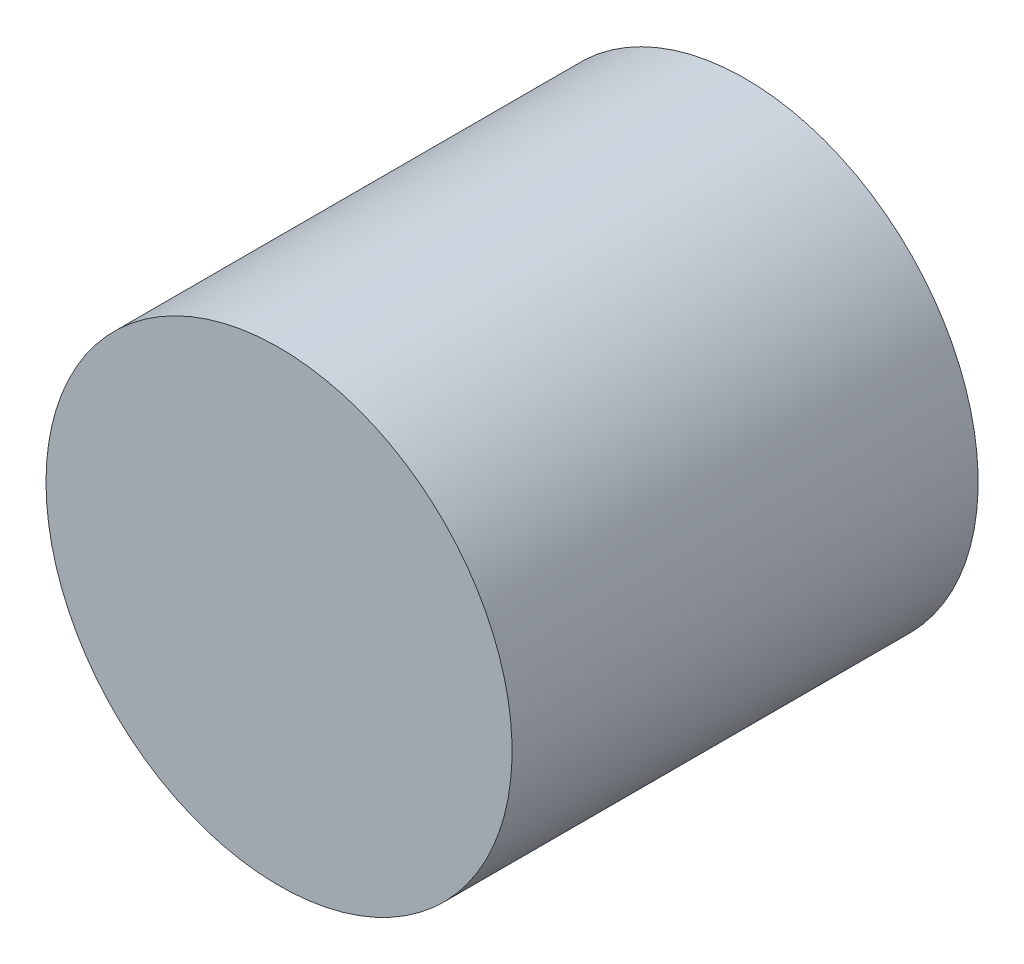
ISO-10303-21;
HEADER;
FILE_DESCRIPTION(('STEP AP214'),'2;1');
FILE_NAME('part.step','',(''),(''),'','','');
FILE_SCHEMA(('AUTOMOTIVE_DESIGN { 1 0 10303 214 1 1 1 1 }'));
ENDSEC;
DATA;
#1=APPLICATION_CONTEXT('core data for automotive mechanical design processes');
#2=APPLICATION_PROTOCOL_DEFINITION('international standard','automotive_design',2000,#1);
#3=PRODUCT_CONTEXT('',#1,'mechanical');
#4=PRODUCT('Part','Part','',(#3));
#5=PRODUCT_RELATED_PRODUCT_CATEGORY('part','',(#4));
#6=PRODUCT_DEFINITION_FORMATION('','',#4);
#7=PRODUCT_DEFINITION_CONTEXT('part definition',#1,'design');
#8=PRODUCT_DEFINITION('design','',#6,#7);
#9=PRODUCT_DEFINITION_SHAPE('','',#8);
#10=(LENGTH_UNIT() NAMED_UNIT(*) SI_UNIT(.MILLI.,.METRE.));
#11=(NAMED_UNIT(*) PLANE_ANGLE_UNIT() SI_UNIT($,.RADIAN.));
#12=(NAMED_UNIT(*) SI_UNIT($,.STERADIAN.) SOLID_ANGLE_UNIT());
#13=UNCERTAINTY_MEASURE_WITH_UNIT(LENGTH_MEASURE(1.E-05),#10,'distance_accuracy_value','');
#14=(GEOMETRIC_REPRESENTATION_CONTEXT(3) GLOBAL_UNCERTAINTY_ASSIGNED_CONTEXT((#13)) GLOBAL_UNIT_ASSIGNED_CONTEXT((#10,
#11,#12)) REPRESENTATION_CONTEXT('',''));
#15=CARTESIAN_POINT('',(0.,0.,0.));
#16=DIRECTION('',(0.,0.,1.));
#17=DIRECTION('',(1.,0.,0.));
#18=AXIS2_PLACEMENT_3D('',#15,#16,#17);
#19=CARTESIAN_POINT('',(0.,0.,60.));
#20=DIRECTION('',(0.,0.,-1.));
#21=DIRECTION('',(-1.,0.,0.));
#22=AXIS2_PLACEMENT_3D('',#19,#20,#21);
#23=CYLINDRICAL_SURFACE('',#22,30.);
#24=CARTESIAN_POINT('',(0.,0.,60.));
#25=DIRECTION('',(0.,0.,1.));
#26=DIRECTION('',(1.,0.,0.));
#27=AXIS2_PLACEMENT_3D('',#24,#25,#26);
#28=CIRCLE('',#27,30.);
#29=CARTESIAN_POINT('',(-30.,0.,60.));
#30=VERTEX_POINT('',#29);
#31=EDGE_CURVE('E10',#30,#30,#28,.T.);
#32=CARTESIAN_POINT('',(0.,0.,0.));
#33=DIRECTION('',(0.,0.,1.));
#34=DIRECTION('',(1.,0.,0.));
#35=AXIS2_PLACEMENT_3D('',#32,#33,#34);
#36=CIRCLE('',#35,30.);
#37=CARTESIAN_POINT('',(-30.,0.,0.));
#38=VERTEX_POINT('',#37);
#39=EDGE_CURVE('E39',#38,#38,#36,.T.);
#40=CARTESIAN_POINT('',(-30.,0.,60.));
#41=CARTESIAN_POINT('',(-30.,0.,59.375));
#42=CARTESIAN_POINT('',(-30.,0.,58.75));
#43=CARTESIAN_POINT('',(-30.,0.,57.5));
#44=CARTESIAN_POINT('',(-30.,0.,56.875));
#45=CARTESIAN_POINT('',(-30.,0.,55.625));
#46=CARTESIAN_POINT('',(-30.,0.,55.));
#47=CARTESIAN_POINT('',(-30.,0.,53.75));
#48=CARTESIAN_POINT('',(-30.,0.,53.125));
#49=CARTESIAN_POINT('',(-30.,0.,51.875));
#50=CARTESIAN_POINT('',(-30.,0.,51.25));
#51=CARTESIAN_POINT('',(-30.,0.,50.));
#52=CARTESIAN_POINT('',(-30.,0.,49.375));
#53=CARTESIAN_POINT('',(-30.,0.,48.125));
#54=CARTESIAN_POINT('',(-30.,0.,47.5));
#55=CARTESIAN_POINT('',(-30.,0.,46.25));
#56=CARTESIAN_POINT('',(-30.,0.,45.625));
#57=CARTESIAN_POINT('',(-30.,0.,44.375));
#58=CARTESIAN_POINT('',(-30.,0.,43.75));
#59=CARTESIAN_POINT('',(-30.,0.,42.5));
#60=CARTESIAN_POINT('',(-30.,0.,41.875));
#61=CARTESIAN_POINT('',(-30.,0.,40.625));
#62=CARTESIAN_POINT('',(-30.,0.,40.));
#63=CARTESIAN_POINT('',(-30.,0.,38.75));
#64=CARTESIAN_POINT('',(-30.,0.,38.125));
#65=CARTESIAN_POINT('',(-30.,0.,36.875));
#66=CARTESIAN_POINT('',(-30.,0.,36.25));
#67=CARTESIAN_POINT('',(-30.,0.,35.));
#68=CARTESIAN_POINT('',(-30.,0.,34.375));
#69=CARTESIAN_POINT('',(-30.,0.,33.125));
#70=CARTESIAN_POINT('',(-30.,0.,32.5));
#71=CARTESIAN_POINT('',(-30.,0.,31.25));
#72=CARTESIAN_POINT('',(-30.,0.,30.625));
#73=CARTESIAN_POINT('',(-30.,0.,29.375));
#74=CARTESIAN_POINT('',(-30.,0.,28.75));
#75=CARTESIAN_POINT('',(-30.,0.,27.5));
#76=CARTESIAN_POINT('',(-30.,0.,26.875));
#77=CARTESIAN_POINT('',(-30.,0.,25.625));
#78=CARTESIAN_POINT('',(-30.,0.,25.));
#79=CARTESIAN_POINT('',(-30.,0.,23.75));
#80=CARTESIAN_POINT('',(-30.,0.,23.125));
#81=CARTESIAN_POINT('',(-30.,0.,21.875));
#82=CARTESIAN_POINT('',(-30.,0.,21.25));
#83=CARTESIAN_POINT('',(-30.,0.,20.));
#84=CARTESIAN_POINT('',(-30.,0.,19.375));
#85=CARTESIAN_POINT('',(-30.,0.,18.125));
#86=CARTESIAN_POINT('',(-30.,0.,17.5));
#87=CARTESIAN_POINT('',(-30.,0.,16.25));
#88=CARTESIAN_POINT('',(-30.,0.,15.625));
#89=CARTESIAN_POINT('',(-30.,0.,14.375));
#90=CARTESIAN_POINT('',(-30.,0.,13.75));
#91=CARTESIAN_POINT('',(-30.,0.,12.5));
#92=CARTESIAN_POINT('',(-30.,0.,11.875));
#93=CARTESIAN_POINT('',(-30.,0.,10.625));
#94=CARTESIAN_POINT('',(-30.,0.,10.));
#95=CARTESIAN_POINT('',(-30.,0.,8.75));
#96=CARTESIAN_POINT('',(-30.,0.,8.125));
#97=CARTESIAN_POINT('',(-30.,0.,6.875));
#98=CARTESIAN_POINT('',(-30.,0.,6.25));
#99=CARTESIAN_POINT('',(-30.,0.,5.));
#100=CARTESIAN_POINT('',(-30.,0.,4.375));
#101=CARTESIAN_POINT('',(-30.,0.,3.125));
#102=CARTESIAN_POINT('',(-30.,0.,2.5));
#103=CARTESIAN_POINT('',(-30.,0.,1.25));
#104=CARTESIAN_POINT('',(-30.,0.,0.625000000000001));
#105=CARTESIAN_POINT('',(-30.,0.,0.));
#106=B_SPLINE_CURVE_WITH_KNOTS('',3,(#40,#41,#42,#43,#44,#45,#46,#47,#48,#49,#50,#51,#52,#53,
#54,#55,#56,#57,#58,#59,#60,#61,#62,#63,#64,#65,#66,#67,#68,#69,#70,#71,#72,#73,#74,#75,#76,#77,
#78,#79,#80,#81,#82,#83,#84,#85,#86,#87,#88,#89,#90,#91,#92,#93,#94,#95,#96,#97,#98,#99,#100,
#101,#102,#103,#104,#105),.UNSPECIFIED.,.F.,.F.,(4,2,2,2,2,2,2,2,2,2,2,2,2,2,2,2,2,2,2,2,2,2,2,
2,2,2,2,2,2,2,2,2,4),(0.,1.875,3.75,5.62500000000001,7.50000000000001,9.375,11.25,13.125,15.,
16.875,18.75,20.625,22.5,24.375,26.25,28.125,30.,31.875,33.75,35.625,37.5,39.375,41.25,43.125,
45.,46.875,48.75,50.625,52.5,54.375,56.25,58.125,60.),.UNSPECIFIED.);
#107=EDGE_CURVE('BSEAM36',#30,#38,#106,.T.);
#108=ORIENTED_EDGE('',*,*,#31,.F.);
#109=ORIENTED_EDGE('',*,*,#39,.T.);
#110=ORIENTED_EDGE('',*,*,#107,.T.);
#111=ORIENTED_EDGE('',*,*,#107,.F.);
#112=EDGE_LOOP('',(#108,#110,#109,#111));
#113=FACE_BOUND('',#112,.T.);
#114=ADVANCED_FACE('F36',(#113),#23,.T.);
#115=CARTESIAN_POINT('',(0.,0.,60.));
#116=DIRECTION('',(0.,0.,1.));
#117=DIRECTION('',(1.,0.,0.));
#118=AXIS2_PLACEMENT_3D('',#115,#116,#117);
#119=PLANE('',#118);
#120=ORIENTED_EDGE('',*,*,#31,.T.);
#121=EDGE_LOOP('',(#120));
#122=FACE_BOUND('',#121,.T.);
#123=ADVANCED_FACE('F51',(#122),#119,.T.);
#124=CARTESIAN_POINT('',(0.,0.,0.));
#125=DIRECTION('',(0.,0.,1.));
#126=DIRECTION('',(1.,0.,0.));
#127=AXIS2_PLACEMENT_3D('',#124,#125,#126);
#128=PLANE('',#127);
#129=ORIENTED_EDGE('',*,*,#39,.F.);
#130=EDGE_LOOP('',(#129));
#131=FACE_BOUND('',#130,.T.);
#132=ADVANCED_FACE('F49',(#131),#128,.F.);
#133=CLOSED_SHELL('',(#114,#123,#132));
#134=MANIFOLD_SOLID_BREP('B2',#133);
#135=ADVANCED_BREP_SHAPE_REPRESENTATION('',(#18,#134),#14);
#136=SHAPE_DEFINITION_REPRESENTATION(#9,#135);
ENDSEC;
END-ISO-10303-21;
